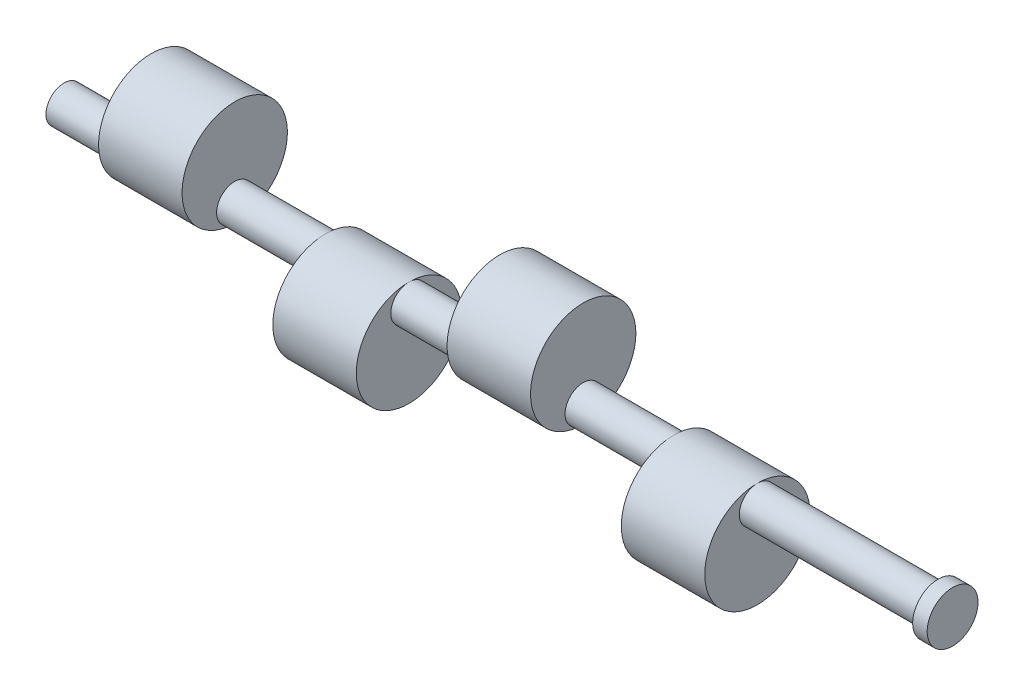
ISO-10303-21;
HEADER;
FILE_DESCRIPTION(('STEP AP214'),'2;1');
FILE_NAME('part.step','',(''),(''),'','','');
FILE_SCHEMA(('AUTOMOTIVE_DESIGN { 1 0 10303 214 1 1 1 1 }'));
ENDSEC;
DATA;
#1=APPLICATION_CONTEXT('core data for automotive mechanical design processes');
#2=APPLICATION_PROTOCOL_DEFINITION('international standard','automotive_design',2000,#1);
#3=PRODUCT_CONTEXT('',#1,'mechanical');
#4=PRODUCT('Part','Part','',(#3));
#5=PRODUCT_RELATED_PRODUCT_CATEGORY('part','',(#4));
#6=PRODUCT_DEFINITION_FORMATION('','',#4);
#7=PRODUCT_DEFINITION_CONTEXT('part definition',#1,'design');
#8=PRODUCT_DEFINITION('design','',#6,#7);
#9=PRODUCT_DEFINITION_SHAPE('','',#8);
#10=(LENGTH_UNIT() NAMED_UNIT(*) SI_UNIT(.MILLI.,.METRE.));
#11=(NAMED_UNIT(*) PLANE_ANGLE_UNIT() SI_UNIT($,.RADIAN.));
#12=(NAMED_UNIT(*) SI_UNIT($,.STERADIAN.) SOLID_ANGLE_UNIT());
#13=UNCERTAINTY_MEASURE_WITH_UNIT(LENGTH_MEASURE(1.E-05),#10,'distance_accuracy_value','');
#14=(GEOMETRIC_REPRESENTATION_CONTEXT(3) GLOBAL_UNCERTAINTY_ASSIGNED_CONTEXT((#13)) GLOBAL_UNIT_ASSIGNED_CONTEXT((#10,
#11,#12)) REPRESENTATION_CONTEXT('',''));
#15=CARTESIAN_POINT('',(0.,0.,0.));
#16=DIRECTION('',(0.,0.,1.));
#17=DIRECTION('',(1.,0.,0.));
#18=AXIS2_PLACEMENT_3D('',#15,#16,#17);
#19=CARTESIAN_POINT('',(0.,0.,0.));
#20=DIRECTION('',(1.,0.,0.));
#21=DIRECTION('',(0.,0.,-1.));
#22=AXIS2_PLACEMENT_3D('',#19,#20,#21);
#23=CYLINDRICAL_SURFACE('',#22,4.99999999999998);
#24=CARTESIAN_POINT('',(-73.89,0.,0.));
#25=DIRECTION('',(-1.,0.,0.));
#26=DIRECTION('',(0.,0.,1.));
#27=AXIS2_PLACEMENT_3D('',#24,#25,#26);
#28=CIRCLE('',#27,4.99999999999998);
#29=CARTESIAN_POINT('',(-73.89,4.99999999999997,0.));
#30=VERTEX_POINT('',#29);
#31=EDGE_CURVE('E11',#30,#30,#28,.F.);
#32=ORIENTED_EDGE('',*,*,#31,.T.);
#33=EDGE_LOOP('',(#32));
#34=FACE_BOUND('',#33,.T.);
#35=CARTESIAN_POINT('',(-24.12,0.,0.));
#36=DIRECTION('',(1.,0.,0.));
#37=DIRECTION('',(0.,0.,-1.));
#38=AXIS2_PLACEMENT_3D('',#35,#36,#37);
#39=CIRCLE('',#38,4.99999999999998);
#40=CARTESIAN_POINT('',(-24.12,0.,-4.99999999999998));
#41=VERTEX_POINT('',#40);
#42=EDGE_CURVE('E36',#41,#41,#39,.F.);
#43=ORIENTED_EDGE('',*,*,#42,.T.);
#44=EDGE_LOOP('',(#43));
#45=FACE_BOUND('',#44,.T.);
#46=ADVANCED_FACE('F32',(#34,#45),#23,.T.);
#47=CARTESIAN_POINT('',(-192.89,0.,0.));
#48=DIRECTION('',(-1.,0.,0.));
#49=DIRECTION('',(0.,0.,1.));
#50=AXIS2_PLACEMENT_3D('',#47,#48,#49);
#51=CIRCLE('',#50,4.99999999999998);
#52=CARTESIAN_POINT('',(-192.89,4.99999999999997,0.));
#53=VERTEX_POINT('',#52);
#54=EDGE_CURVE('E88',#53,#53,#51,.F.);
#55=ORIENTED_EDGE('',*,*,#54,.F.);
#56=EDGE_LOOP('',(#55));
#57=FACE_BOUND('',#56,.T.);
#58=CARTESIAN_POINT('',(-217.89,0.,0.));
#59=DIRECTION('',(-1.,0.,0.));
#60=DIRECTION('',(0.,0.,1.));
#61=AXIS2_PLACEMENT_3D('',#58,#59,#60);
#62=CIRCLE('',#61,4.99999999999998);
#63=CARTESIAN_POINT('',(-217.89,-4.99999999999997,0.));
#64=VERTEX_POINT('',#63);
#65=EDGE_CURVE('E91',#64,#64,#62,.F.);
#66=ORIENTED_EDGE('',*,*,#65,.T.);
#67=EDGE_LOOP('',(#66));
#68=FACE_BOUND('',#67,.T.);
#69=ADVANCED_FACE('F145',(#57,#68),#23,.T.);
#70=CARTESIAN_POINT('',(-217.89,9.50000000000002,0.));
#71=DIRECTION('',(-1.,0.,0.));
#72=DIRECTION('',(0.,0.,1.));
#73=AXIS2_PLACEMENT_3D('',#70,#71,#72);
#74=CYLINDRICAL_SURFACE('',#73,14.5);
#75=CARTESIAN_POINT('',(-240.89,9.50000000000002,0.));
#76=DIRECTION('',(-1.,0.,0.));
#77=DIRECTION('',(0.,0.,1.));
#78=AXIS2_PLACEMENT_3D('',#75,#76,#77);
#79=CIRCLE('',#78,14.5);
#80=CARTESIAN_POINT('',(-240.89,-4.99999999999997,0.));
#81=VERTEX_POINT('',#80);
#82=EDGE_CURVE('E101',#81,#81,#79,.T.);
#83=ORIENTED_EDGE('',*,*,#82,.F.);
#84=EDGE_LOOP('',(#83));
#85=FACE_BOUND('',#84,.T.);
#86=CARTESIAN_POINT('',(-217.89,9.50000000000002,0.));
#87=DIRECTION('',(-1.,0.,0.));
#88=DIRECTION('',(0.,0.,1.));
#89=AXIS2_PLACEMENT_3D('',#86,#87,#88);
#90=CIRCLE('',#89,14.5);
#91=EDGE_CURVE('E100',#64,#64,#90,.T.);
#92=ORIENTED_EDGE('',*,*,#91,.T.);
#93=EDGE_LOOP('',(#92));
#94=FACE_BOUND('',#93,.T.);
#95=ADVANCED_FACE('F150',(#85,#94),#74,.T.);
#96=CARTESIAN_POINT('',(-217.89,9.50000000000002,0.));
#97=DIRECTION('',(-1.,0.,0.));
#98=DIRECTION('',(0.,0.,1.));
#99=AXIS2_PLACEMENT_3D('',#96,#97,#98);
#100=PLANE('',#99);
#101=ORIENTED_EDGE('',*,*,#91,.F.);
#102=ORIENTED_EDGE('',*,*,#65,.F.);
#103=EDGE_LOOP('',(#101,#102));
#104=FACE_BOUND('',#103,.T.);
#105=ADVANCED_FACE('F176',(#104),#100,.F.);
#106=CARTESIAN_POINT('',(-240.89,9.50000000000002,0.));
#107=DIRECTION('',(-1.,0.,0.));
#108=DIRECTION('',(0.,0.,1.));
#109=AXIS2_PLACEMENT_3D('',#106,#107,#108);
#110=PLANE('',#109);
#111=ORIENTED_EDGE('',*,*,#82,.T.);
#112=CARTESIAN_POINT('',(-240.89,0.,0.));
#113=DIRECTION('',(-1.,0.,0.));
#114=DIRECTION('',(0.,0.,1.));
#115=AXIS2_PLACEMENT_3D('',#112,#113,#114);
#116=CIRCLE('',#115,4.99999999999998);
#117=EDGE_CURVE('E94',#81,#81,#116,.F.);
#118=ORIENTED_EDGE('',*,*,#117,.T.);
#119=EDGE_LOOP('',(#111,#118));
#120=FACE_BOUND('',#119,.T.);
#121=ADVANCED_FACE('F167',(#120),#110,.T.);
#122=CARTESIAN_POINT('',(-264.89,0.,0.));
#123=DIRECTION('',(-1.,0.,0.));
#124=DIRECTION('',(0.,0.,1.));
#125=AXIS2_PLACEMENT_3D('',#122,#123,#124);
#126=PLANE('',#125);
#127=CARTESIAN_POINT('',(-264.89,0.,0.));
#128=DIRECTION('',(1.,0.,0.));
#129=DIRECTION('',(0.,0.,-1.));
#130=AXIS2_PLACEMENT_3D('',#127,#128,#129);
#131=CIRCLE('',#130,4.99999999999997);
#132=CARTESIAN_POINT('',(-264.89,0.,-4.99999999999997));
#133=VERTEX_POINT('',#132);
#134=EDGE_CURVE('E97',#133,#133,#131,.T.);
#135=ORIENTED_EDGE('',*,*,#134,.F.);
#136=EDGE_LOOP('',(#135));
#137=FACE_BOUND('',#136,.T.);
#138=ADVANCED_FACE('F158',(#137),#126,.T.);
#139=ORIENTED_EDGE('',*,*,#117,.F.);
#140=EDGE_LOOP('',(#139));
#141=FACE_BOUND('',#140,.T.);
#142=ORIENTED_EDGE('',*,*,#134,.T.);
#143=EDGE_LOOP('',(#142));
#144=FACE_BOUND('',#143,.T.);
#145=ADVANCED_FACE('F34',(#141,#144),#23,.T.);
#146=CARTESIAN_POINT('',(-169.89,-9.50000000000002,0.));
#147=DIRECTION('',(-1.,0.,0.));
#148=DIRECTION('',(0.,0.,1.));
#149=AXIS2_PLACEMENT_3D('',#146,#147,#148);
#150=CYLINDRICAL_SURFACE('',#149,14.5);
#151=CARTESIAN_POINT('',(-192.89,-9.50000000000002,0.));
#152=DIRECTION('',(-1.,0.,0.));
#153=DIRECTION('',(0.,0.,1.));
#154=AXIS2_PLACEMENT_3D('',#151,#152,#153);
#155=CIRCLE('',#154,14.5);
#156=EDGE_CURVE('E107',#53,#53,#155,.T.);
#157=ORIENTED_EDGE('',*,*,#156,.F.);
#158=EDGE_LOOP('',(#157));
#159=FACE_BOUND('',#158,.T.);
#160=CARTESIAN_POINT('',(-169.89,-9.50000000000002,0.));
#161=DIRECTION('',(-1.,0.,0.));
#162=DIRECTION('',(0.,0.,1.));
#163=AXIS2_PLACEMENT_3D('',#160,#161,#162);
#164=CIRCLE('',#163,14.5);
#165=CARTESIAN_POINT('',(-169.89,4.99999999999997,0.));
#166=VERTEX_POINT('',#165);
#167=EDGE_CURVE('E104',#166,#166,#164,.T.);
#168=ORIENTED_EDGE('',*,*,#167,.T.);
#169=EDGE_LOOP('',(#168));
#170=FACE_BOUND('',#169,.T.);
#171=ADVANCED_FACE('F157',(#159,#170),#150,.T.);
#172=CARTESIAN_POINT('',(-169.89,-9.50000000000002,0.));
#173=DIRECTION('',(-1.,0.,0.));
#174=DIRECTION('',(0.,0.,1.));
#175=AXIS2_PLACEMENT_3D('',#172,#173,#174);
#176=PLANE('',#175);
#177=ORIENTED_EDGE('',*,*,#167,.F.);
#178=CARTESIAN_POINT('',(-169.89,0.,0.));
#179=DIRECTION('',(-1.,0.,0.));
#180=DIRECTION('',(0.,0.,1.));
#181=AXIS2_PLACEMENT_3D('',#178,#179,#180);
#182=CIRCLE('',#181,4.99999999999998);
#183=EDGE_CURVE('E85',#166,#166,#182,.F.);
#184=ORIENTED_EDGE('',*,*,#183,.F.);
#185=EDGE_LOOP('',(#177,#184));
#186=FACE_BOUND('',#185,.T.);
#187=ADVANCED_FACE('F164',(#186),#176,.F.);
#188=CARTESIAN_POINT('',(-192.89,-9.50000000000002,0.));
#189=DIRECTION('',(-1.,0.,0.));
#190=DIRECTION('',(0.,0.,1.));
#191=AXIS2_PLACEMENT_3D('',#188,#189,#190);
#192=PLANE('',#191);
#193=ORIENTED_EDGE('',*,*,#156,.T.);
#194=ORIENTED_EDGE('',*,*,#54,.T.);
#195=EDGE_LOOP('',(#193,#194));
#196=FACE_BOUND('',#195,.T.);
#197=ADVANCED_FACE('F188',(#196),#192,.T.);
#198=CARTESIAN_POINT('',(-144.89,0.,0.));
#199=DIRECTION('',(-1.,0.,0.));
#200=DIRECTION('',(0.,0.,1.));
#201=AXIS2_PLACEMENT_3D('',#198,#199,#200);
#202=CIRCLE('',#201,4.99999999999998);
#203=CARTESIAN_POINT('',(-144.89,-4.99999999999997,0.));
#204=VERTEX_POINT('',#203);
#205=EDGE_CURVE('E80',#204,#204,#202,.F.);
#206=ORIENTED_EDGE('',*,*,#205,.F.);
#207=EDGE_LOOP('',(#206));
#208=FACE_BOUND('',#207,.T.);
#209=ORIENTED_EDGE('',*,*,#183,.T.);
#210=EDGE_LOOP('',(#209));
#211=FACE_BOUND('',#210,.T.);
#212=ADVANCED_FACE('F152',(#208,#211),#23,.T.);
#213=CARTESIAN_POINT('',(-121.89,9.50000000000002,0.));
#214=DIRECTION('',(-1.,0.,0.));
#215=DIRECTION('',(0.,0.,1.));
#216=AXIS2_PLACEMENT_3D('',#213,#214,#215);
#217=CYLINDRICAL_SURFACE('',#216,14.5);
#218=CARTESIAN_POINT('',(-144.89,9.50000000000002,0.));
#219=DIRECTION('',(-1.,0.,0.));
#220=DIRECTION('',(0.,0.,1.));
#221=AXIS2_PLACEMENT_3D('',#218,#219,#220);
#222=CIRCLE('',#221,14.5);
#223=EDGE_CURVE('E112',#204,#204,#222,.T.);
#224=ORIENTED_EDGE('',*,*,#223,.F.);
#225=EDGE_LOOP('',(#224));
#226=FACE_BOUND('',#225,.T.);
#227=CARTESIAN_POINT('',(-121.89,9.50000000000002,0.));
#228=DIRECTION('',(-1.,0.,0.));
#229=DIRECTION('',(0.,0.,1.));
#230=AXIS2_PLACEMENT_3D('',#227,#228,#229);
#231=CIRCLE('',#230,14.5);
#232=CARTESIAN_POINT('',(-121.89,-4.99999999999997,0.));
#233=VERTEX_POINT('',#232);
#234=EDGE_CURVE('E53',#233,#233,#231,.T.);
#235=ORIENTED_EDGE('',*,*,#234,.T.);
#236=EDGE_LOOP('',(#235));
#237=FACE_BOUND('',#236,.T.);
#238=ADVANCED_FACE('F195',(#226,#237),#217,.T.);
#239=CARTESIAN_POINT('',(-121.89,9.50000000000002,0.));
#240=DIRECTION('',(-1.,0.,0.));
#241=DIRECTION('',(0.,0.,1.));
#242=AXIS2_PLACEMENT_3D('',#239,#240,#241);
#243=PLANE('',#242);
#244=ORIENTED_EDGE('',*,*,#234,.F.);
#245=CARTESIAN_POINT('',(-121.89,0.,0.));
#246=DIRECTION('',(-1.,0.,0.));
#247=DIRECTION('',(0.,0.,1.));
#248=AXIS2_PLACEMENT_3D('',#245,#246,#247);
#249=CIRCLE('',#248,4.99999999999998);
#250=EDGE_CURVE('E77',#233,#233,#249,.F.);
#251=ORIENTED_EDGE('',*,*,#250,.F.);
#252=EDGE_LOOP('',(#244,#251));
#253=FACE_BOUND('',#252,.T.);
#254=ADVANCED_FACE('F198',(#253),#243,.F.);
#255=CARTESIAN_POINT('',(-144.89,9.50000000000002,0.));
#256=DIRECTION('',(-1.,0.,0.));
#257=DIRECTION('',(0.,0.,1.));
#258=AXIS2_PLACEMENT_3D('',#255,#256,#257);
#259=PLANE('',#258);
#260=ORIENTED_EDGE('',*,*,#223,.T.);
#261=ORIENTED_EDGE('',*,*,#205,.T.);
#262=EDGE_LOOP('',(#260,#261));
#263=FACE_BOUND('',#262,.T.);
#264=ADVANCED_FACE('F155',(#263),#259,.T.);
#265=CARTESIAN_POINT('',(-96.89,0.,0.));
#266=DIRECTION('',(-1.,0.,0.));
#267=DIRECTION('',(0.,0.,1.));
#268=AXIS2_PLACEMENT_3D('',#265,#266,#267);
#269=CIRCLE('',#268,4.99999999999998);
#270=CARTESIAN_POINT('',(-96.89,4.99999999999997,0.));
#271=VERTEX_POINT('',#270);
#272=EDGE_CURVE('E41',#271,#271,#269,.F.);
#273=ORIENTED_EDGE('',*,*,#272,.F.);
#274=EDGE_LOOP('',(#273));
#275=FACE_BOUND('',#274,.T.);
#276=ORIENTED_EDGE('',*,*,#250,.T.);
#277=EDGE_LOOP('',(#276));
#278=FACE_BOUND('',#277,.T.);
#279=ADVANCED_FACE('F73',(#275,#278),#23,.T.);
#280=CARTESIAN_POINT('',(-73.89,-9.50000000000002,0.));
#281=DIRECTION('',(-1.,0.,0.));
#282=DIRECTION('',(0.,0.,1.));
#283=AXIS2_PLACEMENT_3D('',#280,#281,#282);
#284=CYLINDRICAL_SURFACE('',#283,14.5);
#285=CARTESIAN_POINT('',(-96.89,-9.50000000000002,0.));
#286=DIRECTION('',(-1.,0.,0.));
#287=DIRECTION('',(0.,0.,1.));
#288=AXIS2_PLACEMENT_3D('',#285,#286,#287);
#289=CIRCLE('',#288,14.5);
#290=EDGE_CURVE('E116',#271,#271,#289,.T.);
#291=ORIENTED_EDGE('',*,*,#290,.F.);
#292=EDGE_LOOP('',(#291));
#293=FACE_BOUND('',#292,.T.);
#294=CARTESIAN_POINT('',(-73.89,-9.50000000000002,0.));
#295=DIRECTION('',(-1.,0.,0.));
#296=DIRECTION('',(0.,0.,1.));
#297=AXIS2_PLACEMENT_3D('',#294,#295,#296);
#298=CIRCLE('',#297,14.5);
#299=EDGE_CURVE('E47',#30,#30,#298,.T.);
#300=ORIENTED_EDGE('',*,*,#299,.T.);
#301=EDGE_LOOP('',(#300));
#302=FACE_BOUND('',#301,.T.);
#303=ADVANCED_FACE('F154',(#293,#302),#284,.T.);
#304=CARTESIAN_POINT('',(-73.89,-9.50000000000002,0.));
#305=DIRECTION('',(-1.,0.,0.));
#306=DIRECTION('',(0.,0.,1.));
#307=AXIS2_PLACEMENT_3D('',#304,#305,#306);
#308=PLANE('',#307);
#309=ORIENTED_EDGE('',*,*,#299,.F.);
#310=ORIENTED_EDGE('',*,*,#31,.F.);
#311=EDGE_LOOP('',(#309,#310));
#312=FACE_BOUND('',#311,.T.);
#313=ADVANCED_FACE('F207',(#312),#308,.F.);
#314=CARTESIAN_POINT('',(-96.89,-9.50000000000002,0.));
#315=DIRECTION('',(-1.,0.,0.));
#316=DIRECTION('',(0.,0.,1.));
#317=AXIS2_PLACEMENT_3D('',#314,#315,#316);
#318=PLANE('',#317);
#319=ORIENTED_EDGE('',*,*,#290,.T.);
#320=ORIENTED_EDGE('',*,*,#272,.T.);
#321=EDGE_LOOP('',(#319,#320));
#322=FACE_BOUND('',#321,.T.);
#323=ADVANCED_FACE('F142',(#322),#318,.T.);
#324=CARTESIAN_POINT('',(-24.12,0.,0.));
#325=DIRECTION('',(1.,0.,0.));
#326=DIRECTION('',(0.,0.,-1.));
#327=AXIS2_PLACEMENT_3D('',#324,#325,#326);
#328=CYLINDRICAL_SURFACE('',#327,7.);
#329=CARTESIAN_POINT('',(-24.12,0.,0.));
#330=DIRECTION('',(1.,0.,0.));
#331=DIRECTION('',(0.,0.,-1.));
#332=AXIS2_PLACEMENT_3D('',#329,#330,#331);
#333=CIRCLE('',#332,7.);
#334=CARTESIAN_POINT('',(-24.12,0.,-7.));
#335=VERTEX_POINT('',#334);
#336=EDGE_CURVE('E122',#335,#335,#333,.T.);
#337=ORIENTED_EDGE('',*,*,#336,.T.);
#338=EDGE_LOOP('',(#337));
#339=FACE_BOUND('',#338,.T.);
#340=CARTESIAN_POINT('',(-20.12,0.,0.));
#341=DIRECTION('',(1.,0.,0.));
#342=DIRECTION('',(0.,0.,-1.));
#343=AXIS2_PLACEMENT_3D('',#340,#341,#342);
#344=CIRCLE('',#343,7.);
#345=CARTESIAN_POINT('',(-20.12,0.,-7.));
#346=VERTEX_POINT('',#345);
#347=EDGE_CURVE('E119',#346,#346,#344,.T.);
#348=ORIENTED_EDGE('',*,*,#347,.F.);
#349=EDGE_LOOP('',(#348));
#350=FACE_BOUND('',#349,.T.);
#351=ADVANCED_FACE('F134',(#339,#350),#328,.T.);
#352=CARTESIAN_POINT('',(-24.12,0.,0.));
#353=DIRECTION('',(1.,0.,0.));
#354=DIRECTION('',(0.,0.,-1.));
#355=AXIS2_PLACEMENT_3D('',#352,#353,#354);
#356=PLANE('',#355);
#357=ORIENTED_EDGE('',*,*,#42,.F.);
#358=EDGE_LOOP('',(#357));
#359=FACE_BOUND('',#358,.T.);
#360=ORIENTED_EDGE('',*,*,#336,.F.);
#361=EDGE_LOOP('',(#360));
#362=FACE_BOUND('',#361,.T.);
#363=ADVANCED_FACE('F130',(#359,#362),#356,.F.);
#364=CARTESIAN_POINT('',(-20.12,0.,0.));
#365=DIRECTION('',(1.,0.,0.));
#366=DIRECTION('',(0.,0.,-1.));
#367=AXIS2_PLACEMENT_3D('',#364,#365,#366);
#368=PLANE('',#367);
#369=ORIENTED_EDGE('',*,*,#347,.T.);
#370=EDGE_LOOP('',(#369));
#371=FACE_BOUND('',#370,.T.);
#372=ADVANCED_FACE('F133',(#371),#368,.T.);
#373=CLOSED_SHELL('',(#46,#69,#95,#105,#121,#138,#145,#171,#187,#197,#212,#238,#254,#264,#279,
#303,#313,#323,#351,#363,#372));
#374=MANIFOLD_SOLID_BREP('B2',#373);
#375=ADVANCED_BREP_SHAPE_REPRESENTATION('',(#18,#374),#14);
#376=SHAPE_DEFINITION_REPRESENTATION(#9,#375);
ENDSEC;
END-ISO-10303-21;
